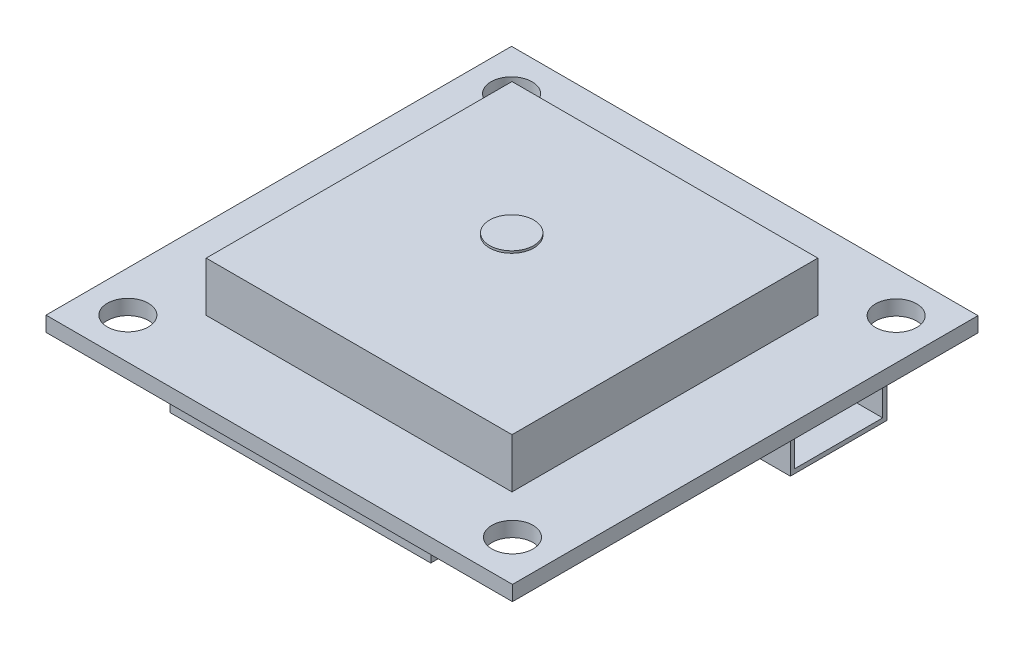
ISO-10303-21;
HEADER;
FILE_DESCRIPTION(('STEP AP214'),'2;1');
FILE_NAME('part.step','',(''),(''),'','','');
FILE_SCHEMA(('AUTOMOTIVE_DESIGN { 1 0 10303 214 1 1 1 1 }'));
ENDSEC;
DATA;
#1=APPLICATION_CONTEXT('core data for automotive mechanical design processes');
#2=APPLICATION_PROTOCOL_DEFINITION('international standard','automotive_design',2000,#1);
#3=PRODUCT_CONTEXT('',#1,'mechanical');
#4=PRODUCT('Part','Part','',(#3));
#5=PRODUCT_RELATED_PRODUCT_CATEGORY('part','',(#4));
#6=PRODUCT_DEFINITION_FORMATION('','',#4);
#7=PRODUCT_DEFINITION_CONTEXT('part definition',#1,'design');
#8=PRODUCT_DEFINITION('design','',#6,#7);
#9=PRODUCT_DEFINITION_SHAPE('','',#8);
#10=(LENGTH_UNIT() NAMED_UNIT(*) SI_UNIT(.MILLI.,.METRE.));
#11=(NAMED_UNIT(*) PLANE_ANGLE_UNIT() SI_UNIT($,.RADIAN.));
#12=(NAMED_UNIT(*) SI_UNIT($,.STERADIAN.) SOLID_ANGLE_UNIT());
#13=UNCERTAINTY_MEASURE_WITH_UNIT(LENGTH_MEASURE(1.E-05),#10,'distance_accuracy_value','');
#14=(GEOMETRIC_REPRESENTATION_CONTEXT(3) GLOBAL_UNCERTAINTY_ASSIGNED_CONTEXT((#13)) GLOBAL_UNIT_ASSIGNED_CONTEXT((#10,
#11,#12)) REPRESENTATION_CONTEXT('',''));
#15=CARTESIAN_POINT('',(0.,0.,0.));
#16=DIRECTION('',(0.,0.,1.));
#17=DIRECTION('',(1.,0.,0.));
#18=AXIS2_PLACEMENT_3D('',#15,#16,#17);
#19=CARTESIAN_POINT('',(0.,0.,0.));
#20=DIRECTION('',(0.,-1.,0.));
#21=DIRECTION('',(0.,0.,-1.));
#22=AXIS2_PLACEMENT_3D('',#19,#20,#21);
#23=PLANE('',#22);
#24=DIRECTION('',(1.,0.,0.));
#25=VECTOR('',#24,1.);
#26=CARTESIAN_POINT('',(33.528,0.,-31.3055));
#27=LINE('',#26,#25);
#28=CARTESIAN_POINT('',(33.528,0.,-31.3055));
#29=VERTEX_POINT('',#28);
#30=CARTESIAN_POINT('',(37.846,0.,-31.3055));
#31=VERTEX_POINT('',#30);
#32=EDGE_CURVE('E307',#29,#31,#27,.T.);
#33=ORIENTED_EDGE('',*,*,#32,.F.);
#34=DIRECTION('',(0.,0.,-1.));
#35=VECTOR('',#34,1.);
#36=CARTESIAN_POINT('',(33.528,0.,-23.3553));
#37=LINE('',#36,#35);
#38=CARTESIAN_POINT('',(33.528,0.,-23.3553));
#39=VERTEX_POINT('',#38);
#40=EDGE_CURVE('E287',#39,#29,#37,.T.);
#41=ORIENTED_EDGE('',*,*,#40,.F.);
#42=DIRECTION('',(-1.,0.,0.));
#43=VECTOR('',#42,1.);
#44=CARTESIAN_POINT('',(33.528,0.,-23.3553));
#45=LINE('',#44,#43);
#46=CARTESIAN_POINT('',(37.846,0.,-23.3553));
#47=VERTEX_POINT('',#46);
#48=EDGE_CURVE('E298',#47,#39,#45,.T.);
#49=ORIENTED_EDGE('',*,*,#48,.F.);
#50=DIRECTION('',(0.,0.,1.));
#51=VECTOR('',#50,1.);
#52=CARTESIAN_POINT('',(37.846,0.,-23.3553));
#53=LINE('',#52,#51);
#54=EDGE_CURVE('E309',#31,#47,#53,.T.);
#55=ORIENTED_EDGE('',*,*,#54,.F.);
#56=EDGE_LOOP('',(#33,#41,#49,#55));
#57=FACE_BOUND('',#56,.T.);
#58=DIRECTION('',(0.,0.,1.));
#59=VECTOR('',#58,1.);
#60=CARTESIAN_POINT('',(0.,0.,0.));
#61=LINE('',#60,#59);
#62=CARTESIAN_POINT('',(0.,0.,-38.2778));
#63=VERTEX_POINT('',#62);
#64=CARTESIAN_POINT('',(0.,0.,0.));
#65=VERTEX_POINT('',#64);
#66=EDGE_CURVE('E382',#63,#65,#61,.T.);
#67=ORIENTED_EDGE('',*,*,#66,.F.);
#68=DIRECTION('',(-1.,0.,0.));
#69=VECTOR('',#68,1.);
#70=CARTESIAN_POINT('',(0.,0.,-38.2778));
#71=LINE('',#70,#69);
#72=CARTESIAN_POINT('',(38.354,0.,-38.2778));
#73=VERTEX_POINT('',#72);
#74=EDGE_CURVE('E387',#73,#63,#71,.T.);
#75=ORIENTED_EDGE('',*,*,#74,.F.);
#76=DIRECTION('',(0.,0.,-1.));
#77=VECTOR('',#76,1.);
#78=CARTESIAN_POINT('',(38.354,0.,0.));
#79=LINE('',#78,#77);
#80=CARTESIAN_POINT('',(38.354,0.,0.));
#81=VERTEX_POINT('',#80);
#82=EDGE_CURVE('E398',#81,#73,#79,.T.);
#83=ORIENTED_EDGE('',*,*,#82,.F.);
#84=DIRECTION('',(1.,0.,0.));
#85=VECTOR('',#84,1.);
#86=CARTESIAN_POINT('',(0.,0.,0.));
#87=LINE('',#86,#85);
#88=EDGE_CURVE('E396',#65,#81,#87,.T.);
#89=ORIENTED_EDGE('',*,*,#88,.F.);
#90=EDGE_LOOP('',(#67,#75,#83,#89));
#91=FACE_BOUND('',#90,.T.);
#92=CARTESIAN_POINT('',(22.2758,0.,-32.6263));
#93=DIRECTION('',(0.,-1.,0.));
#94=DIRECTION('',(0.,0.,-1.));
#95=AXIS2_PLACEMENT_3D('',#92,#93,#94);
#96=CIRCLE('',#95,3.3782);
#97=CARTESIAN_POINT('',(22.2758,0.,-36.0045));
#98=VERTEX_POINT('',#97);
#99=EDGE_CURVE('E322',#98,#98,#96,.T.);
#100=ORIENTED_EDGE('',*,*,#99,.F.);
#101=EDGE_LOOP('',(#100));
#102=FACE_BOUND('',#101,.T.);
#103=CARTESIAN_POINT('',(34.9885,0.,-3.3655));
#104=DIRECTION('',(0.,-1.,0.));
#105=DIRECTION('',(0.,0.,-1.));
#106=AXIS2_PLACEMENT_3D('',#103,#104,#105);
#107=CIRCLE('',#106,1.6891);
#108=CARTESIAN_POINT('',(34.9885,0.,-5.0546));
#109=VERTEX_POINT('',#108);
#110=EDGE_CURVE('E253',#109,#109,#107,.F.);
#111=ORIENTED_EDGE('',*,*,#110,.T.);
#112=EDGE_LOOP('',(#111));
#113=FACE_BOUND('',#112,.T.);
#114=CARTESIAN_POINT('',(3.36550000000002,0.,-3.3655));
#115=DIRECTION('',(0.,-1.,0.));
#116=DIRECTION('',(0.,0.,-1.));
#117=AXIS2_PLACEMENT_3D('',#114,#115,#116);
#118=CIRCLE('',#117,1.6891);
#119=CARTESIAN_POINT('',(3.36550000000002,0.,-5.0546));
#120=VERTEX_POINT('',#119);
#121=EDGE_CURVE('E247',#120,#120,#118,.F.);
#122=ORIENTED_EDGE('',*,*,#121,.T.);
#123=EDGE_LOOP('',(#122));
#124=FACE_BOUND('',#123,.T.);
#125=CARTESIAN_POINT('',(3.36550000000002,0.,-34.9123));
#126=DIRECTION('',(0.,-1.,0.));
#127=DIRECTION('',(0.,0.,-1.));
#128=AXIS2_PLACEMENT_3D('',#125,#126,#127);
#129=CIRCLE('',#128,1.68909999999999);
#130=CARTESIAN_POINT('',(3.36550000000002,0.,-36.6014));
#131=VERTEX_POINT('',#130);
#132=EDGE_CURVE('E241',#131,#131,#129,.F.);
#133=ORIENTED_EDGE('',*,*,#132,.T.);
#134=EDGE_LOOP('',(#133));
#135=FACE_BOUND('',#134,.T.);
#136=CARTESIAN_POINT('',(34.9885,0.,-34.9123));
#137=DIRECTION('',(0.,-1.,0.));
#138=DIRECTION('',(0.,0.,-1.));
#139=AXIS2_PLACEMENT_3D('',#136,#137,#138);
#140=CIRCLE('',#139,1.6891);
#141=CARTESIAN_POINT('',(34.9885,0.,-36.6014));
#142=VERTEX_POINT('',#141);
#143=EDGE_CURVE('E237',#142,#142,#140,.F.);
#144=ORIENTED_EDGE('',*,*,#143,.T.);
#145=EDGE_LOOP('',(#144));
#146=FACE_BOUND('',#145,.T.);
#147=DIRECTION('',(1.,0.,0.));
#148=VECTOR('',#147,1.);
#149=CARTESIAN_POINT('',(7.8613,0.,-18.77695));
#150=LINE('',#149,#148);
#151=CARTESIAN_POINT('',(7.8613,0.,-18.77695));
#152=VERTEX_POINT('',#151);
#153=CARTESIAN_POINT('',(30.3403,0.,-18.77695));
#154=VERTEX_POINT('',#153);
#155=EDGE_CURVE('E496',#152,#154,#150,.T.);
#156=ORIENTED_EDGE('',*,*,#155,.F.);
#157=DIRECTION('',(0.,0.,-1.));
#158=VECTOR('',#157,1.);
#159=CARTESIAN_POINT('',(7.8613,0.,-1.64464999999999));
#160=LINE('',#159,#158);
#161=CARTESIAN_POINT('',(7.8613,0.,-1.64464999999999));
#162=VERTEX_POINT('',#161);
#163=EDGE_CURVE('E221',#162,#152,#160,.T.);
#164=ORIENTED_EDGE('',*,*,#163,.F.);
#165=DIRECTION('',(-1.,0.,0.));
#166=VECTOR('',#165,1.);
#167=CARTESIAN_POINT('',(7.8613,0.,-1.64464999999999));
#168=LINE('',#167,#166);
#169=CARTESIAN_POINT('',(30.3403,0.,-1.64464999999999));
#170=VERTEX_POINT('',#169);
#171=EDGE_CURVE('E217',#170,#162,#168,.T.);
#172=ORIENTED_EDGE('',*,*,#171,.F.);
#173=DIRECTION('',(0.,0.,1.));
#174=VECTOR('',#173,1.);
#175=CARTESIAN_POINT('',(30.3403,0.,-1.64464999999999));
#176=LINE('',#175,#174);
#177=EDGE_CURVE('E498',#154,#170,#176,.T.);
#178=ORIENTED_EDGE('',*,*,#177,.F.);
#179=EDGE_LOOP('',(#156,#164,#172,#178));
#180=FACE_BOUND('',#179,.T.);
#181=ADVANCED_FACE('F38',(#57,#91,#102,#113,#124,#135,#146,#180),#23,.T.);
#182=CARTESIAN_POINT('',(0.,5.3086,0.));
#183=DIRECTION('',(0.,-1.,0.));
#184=DIRECTION('',(0.,0.,-1.));
#185=AXIS2_PLACEMENT_3D('',#182,#183,#184);
#186=PLANE('',#185);
#187=DIRECTION('',(0.,0.,-1.));
#188=VECTOR('',#187,1.);
#189=CARTESIAN_POINT('',(31.75,5.3086,-31.7119));
#190=LINE('',#189,#188);
#191=CARTESIAN_POINT('',(31.75,5.3086,-6.5659));
#192=VERTEX_POINT('',#191);
#193=CARTESIAN_POINT('',(31.75,5.3086,-31.7119));
#194=VERTEX_POINT('',#193);
#195=EDGE_CURVE('E350',#192,#194,#190,.T.);
#196=ORIENTED_EDGE('',*,*,#195,.T.);
#197=DIRECTION('',(-1.,0.,0.));
#198=VECTOR('',#197,1.);
#199=CARTESIAN_POINT('',(31.75,5.3086,-31.7119));
#200=LINE('',#199,#198);
#201=CARTESIAN_POINT('',(6.604,5.3086,-31.7119));
#202=VERTEX_POINT('',#201);
#203=EDGE_CURVE('E353',#194,#202,#200,.T.);
#204=ORIENTED_EDGE('',*,*,#203,.T.);
#205=DIRECTION('',(0.,0.,1.));
#206=VECTOR('',#205,1.);
#207=CARTESIAN_POINT('',(6.604,5.3086,-31.7119));
#208=LINE('',#207,#206);
#209=CARTESIAN_POINT('',(6.604,5.3086,-6.56589999999999));
#210=VERTEX_POINT('',#209);
#211=EDGE_CURVE('E356',#202,#210,#208,.T.);
#212=ORIENTED_EDGE('',*,*,#211,.T.);
#213=DIRECTION('',(1.,0.,0.));
#214=VECTOR('',#213,1.);
#215=CARTESIAN_POINT('',(31.75,5.3086,-6.5659));
#216=LINE('',#215,#214);
#217=EDGE_CURVE('E358',#210,#192,#216,.T.);
#218=ORIENTED_EDGE('',*,*,#217,.T.);
#219=EDGE_LOOP('',(#196,#204,#212,#218));
#220=FACE_BOUND('',#219,.T.);
#221=CARTESIAN_POINT('',(17.5387,5.3086,-20.7518));
#222=DIRECTION('',(0.,-1.,0.));
#223=DIRECTION('',(0.,0.,-1.));
#224=AXIS2_PLACEMENT_3D('',#221,#222,#223);
#225=CIRCLE('',#224,1.8161);
#226=CARTESIAN_POINT('',(17.5387,5.3086,-22.5679));
#227=VERTEX_POINT('',#226);
#228=EDGE_CURVE('E46',#227,#227,#225,.F.);
#229=ORIENTED_EDGE('',*,*,#228,.F.);
#230=EDGE_LOOP('',(#229));
#231=FACE_BOUND('',#230,.T.);
#232=ADVANCED_FACE('F416',(#220,#231),#186,.F.);
#233=CARTESIAN_POINT('',(0.,1.2319,0.));
#234=DIRECTION('',(0.,-1.,0.));
#235=DIRECTION('',(0.,0.,-1.));
#236=AXIS2_PLACEMENT_3D('',#233,#234,#235);
#237=PLANE('',#236);
#238=CARTESIAN_POINT('',(34.9885,1.2319,-34.9123));
#239=DIRECTION('',(0.,1.,0.));
#240=DIRECTION('',(0.,0.,1.));
#241=AXIS2_PLACEMENT_3D('',#238,#239,#240);
#242=CIRCLE('',#241,1.6891);
#243=CARTESIAN_POINT('',(34.9885,1.2319,-33.2232));
#244=VERTEX_POINT('',#243);
#245=EDGE_CURVE('E238',#244,#244,#242,.T.);
#246=ORIENTED_EDGE('',*,*,#245,.F.);
#247=EDGE_LOOP('',(#246));
#248=FACE_BOUND('',#247,.T.);
#249=CARTESIAN_POINT('',(3.36550000000002,1.2319,-34.9123));
#250=DIRECTION('',(0.,1.,0.));
#251=DIRECTION('',(0.,0.,1.));
#252=AXIS2_PLACEMENT_3D('',#249,#250,#251);
#253=CIRCLE('',#252,1.68909999999999);
#254=CARTESIAN_POINT('',(3.36550000000002,1.2319,-33.2232));
#255=VERTEX_POINT('',#254);
#256=EDGE_CURVE('E244',#255,#255,#253,.T.);
#257=ORIENTED_EDGE('',*,*,#256,.F.);
#258=EDGE_LOOP('',(#257));
#259=FACE_BOUND('',#258,.T.);
#260=CARTESIAN_POINT('',(3.36550000000002,1.2319,-3.3655));
#261=DIRECTION('',(0.,1.,0.));
#262=DIRECTION('',(0.,0.,1.));
#263=AXIS2_PLACEMENT_3D('',#260,#261,#262);
#264=CIRCLE('',#263,1.6891);
#265=CARTESIAN_POINT('',(3.36550000000002,1.2319,-1.6764));
#266=VERTEX_POINT('',#265);
#267=EDGE_CURVE('E250',#266,#266,#264,.T.);
#268=ORIENTED_EDGE('',*,*,#267,.F.);
#269=EDGE_LOOP('',(#268));
#270=FACE_BOUND('',#269,.T.);
#271=CARTESIAN_POINT('',(34.9885,1.2319,-3.3655));
#272=DIRECTION('',(0.,1.,0.));
#273=DIRECTION('',(0.,0.,1.));
#274=AXIS2_PLACEMENT_3D('',#271,#272,#273);
#275=CIRCLE('',#274,1.6891);
#276=CARTESIAN_POINT('',(34.9885,1.2319,-1.6764));
#277=VERTEX_POINT('',#276);
#278=EDGE_CURVE('E256',#277,#277,#275,.T.);
#279=ORIENTED_EDGE('',*,*,#278,.F.);
#280=EDGE_LOOP('',(#279));
#281=FACE_BOUND('',#280,.T.);
#282=DIRECTION('',(0.,0.,1.));
#283=VECTOR('',#282,1.);
#284=CARTESIAN_POINT('',(0.,1.2319,0.));
#285=LINE('',#284,#283);
#286=CARTESIAN_POINT('',(0.,1.2319,-38.2778));
#287=VERTEX_POINT('',#286);
#288=CARTESIAN_POINT('',(0.,1.2319,0.));
#289=VERTEX_POINT('',#288);
#290=EDGE_CURVE('E383',#287,#289,#285,.T.);
#291=ORIENTED_EDGE('',*,*,#290,.T.);
#292=DIRECTION('',(1.,0.,0.));
#293=VECTOR('',#292,1.);
#294=CARTESIAN_POINT('',(0.,1.2319,0.));
#295=LINE('',#294,#293);
#296=CARTESIAN_POINT('',(38.354,1.2319,0.));
#297=VERTEX_POINT('',#296);
#298=EDGE_CURVE('E386',#289,#297,#295,.T.);
#299=ORIENTED_EDGE('',*,*,#298,.T.);
#300=DIRECTION('',(0.,0.,-1.));
#301=VECTOR('',#300,1.);
#302=CARTESIAN_POINT('',(38.354,1.2319,0.));
#303=LINE('',#302,#301);
#304=CARTESIAN_POINT('',(38.354,1.2319,-38.2778));
#305=VERTEX_POINT('',#304);
#306=EDGE_CURVE('E389',#297,#305,#303,.T.);
#307=ORIENTED_EDGE('',*,*,#306,.T.);
#308=DIRECTION('',(-1.,0.,0.));
#309=VECTOR('',#308,1.);
#310=CARTESIAN_POINT('',(0.,1.2319,-38.2778));
#311=LINE('',#310,#309);
#312=EDGE_CURVE('E391',#305,#287,#311,.T.);
#313=ORIENTED_EDGE('',*,*,#312,.T.);
#314=EDGE_LOOP('',(#291,#299,#307,#313));
#315=FACE_BOUND('',#314,.T.);
#316=DIRECTION('',(0.,0.,-1.));
#317=VECTOR('',#316,1.);
#318=CARTESIAN_POINT('',(31.75,1.2319,-31.7119));
#319=LINE('',#318,#317);
#320=CARTESIAN_POINT('',(31.75,1.2319,-6.5659));
#321=VERTEX_POINT('',#320);
#322=CARTESIAN_POINT('',(31.75,1.2319,-31.7119));
#323=VERTEX_POINT('',#322);
#324=EDGE_CURVE('E349',#321,#323,#319,.T.);
#325=ORIENTED_EDGE('',*,*,#324,.F.);
#326=DIRECTION('',(1.,0.,0.));
#327=VECTOR('',#326,1.);
#328=CARTESIAN_POINT('',(31.75,1.2319,-6.5659));
#329=LINE('',#328,#327);
#330=CARTESIAN_POINT('',(6.604,1.2319,-6.56589999999999));
#331=VERTEX_POINT('',#330);
#332=EDGE_CURVE('E354',#331,#321,#329,.T.);
#333=ORIENTED_EDGE('',*,*,#332,.F.);
#334=DIRECTION('',(0.,0.,1.));
#335=VECTOR('',#334,1.);
#336=CARTESIAN_POINT('',(6.604,1.2319,-31.7119));
#337=LINE('',#336,#335);
#338=CARTESIAN_POINT('',(6.604,1.2319,-31.7119));
#339=VERTEX_POINT('',#338);
#340=EDGE_CURVE('E366',#339,#331,#337,.T.);
#341=ORIENTED_EDGE('',*,*,#340,.F.);
#342=DIRECTION('',(-1.,0.,0.));
#343=VECTOR('',#342,1.);
#344=CARTESIAN_POINT('',(31.75,1.2319,-31.7119));
#345=LINE('',#344,#343);
#346=EDGE_CURVE('E363',#323,#339,#345,.T.);
#347=ORIENTED_EDGE('',*,*,#346,.F.);
#348=EDGE_LOOP('',(#325,#333,#341,#347));
#349=FACE_BOUND('',#348,.T.);
#350=ADVANCED_FACE('F418',(#248,#259,#270,#281,#315,#349),#237,.F.);
#351=CARTESIAN_POINT('',(0.,1.2319,0.));
#352=DIRECTION('',(1.,0.,0.));
#353=DIRECTION('',(0.,0.,-1.));
#354=AXIS2_PLACEMENT_3D('',#351,#352,#353);
#355=PLANE('',#354);
#356=ORIENTED_EDGE('',*,*,#66,.T.);
#357=DIRECTION('',(0.,-1.,0.));
#358=VECTOR('',#357,1.);
#359=CARTESIAN_POINT('',(0.,1.2319,0.));
#360=LINE('',#359,#358);
#361=EDGE_CURVE('E409',#289,#65,#360,.T.);
#362=ORIENTED_EDGE('',*,*,#361,.F.);
#363=ORIENTED_EDGE('',*,*,#290,.F.);
#364=DIRECTION('',(0.,-1.,0.));
#365=VECTOR('',#364,1.);
#366=CARTESIAN_POINT('',(0.,1.2319,-38.2778));
#367=LINE('',#366,#365);
#368=EDGE_CURVE('E393',#287,#63,#367,.T.);
#369=ORIENTED_EDGE('',*,*,#368,.T.);
#370=EDGE_LOOP('',(#356,#362,#363,#369));
#371=FACE_BOUND('',#370,.T.);
#372=ADVANCED_FACE('F40',(#371),#355,.F.);
#373=CARTESIAN_POINT('',(0.,1.2319,0.));
#374=DIRECTION('',(0.,0.,-1.));
#375=DIRECTION('',(-1.,0.,0.));
#376=AXIS2_PLACEMENT_3D('',#373,#374,#375);
#377=PLANE('',#376);
#378=ORIENTED_EDGE('',*,*,#88,.T.);
#379=DIRECTION('',(0.,-1.,0.));
#380=VECTOR('',#379,1.);
#381=CARTESIAN_POINT('',(38.354,1.2319,0.));
#382=LINE('',#381,#380);
#383=EDGE_CURVE('E406',#297,#81,#382,.T.);
#384=ORIENTED_EDGE('',*,*,#383,.F.);
#385=ORIENTED_EDGE('',*,*,#298,.F.);
#386=ORIENTED_EDGE('',*,*,#361,.T.);
#387=EDGE_LOOP('',(#378,#384,#385,#386));
#388=FACE_BOUND('',#387,.T.);
#389=ADVANCED_FACE('F456',(#388),#377,.F.);
#390=CARTESIAN_POINT('',(38.354,1.2319,0.));
#391=DIRECTION('',(-1.,0.,0.));
#392=DIRECTION('',(0.,0.,1.));
#393=AXIS2_PLACEMENT_3D('',#390,#391,#392);
#394=PLANE('',#393);
#395=ORIENTED_EDGE('',*,*,#82,.T.);
#396=DIRECTION('',(0.,-1.,0.));
#397=VECTOR('',#396,1.);
#398=CARTESIAN_POINT('',(38.354,1.2319,-38.2778));
#399=LINE('',#398,#397);
#400=EDGE_CURVE('E403',#305,#73,#399,.T.);
#401=ORIENTED_EDGE('',*,*,#400,.F.);
#402=ORIENTED_EDGE('',*,*,#306,.F.);
#403=ORIENTED_EDGE('',*,*,#383,.T.);
#404=EDGE_LOOP('',(#395,#401,#402,#403));
#405=FACE_BOUND('',#404,.T.);
#406=ADVANCED_FACE('F453',(#405),#394,.F.);
#407=CARTESIAN_POINT('',(0.,1.2319,-38.2778));
#408=DIRECTION('',(0.,0.,1.));
#409=DIRECTION('',(1.,0.,0.));
#410=AXIS2_PLACEMENT_3D('',#407,#408,#409);
#411=PLANE('',#410);
#412=ORIENTED_EDGE('',*,*,#74,.T.);
#413=ORIENTED_EDGE('',*,*,#368,.F.);
#414=ORIENTED_EDGE('',*,*,#312,.F.);
#415=ORIENTED_EDGE('',*,*,#400,.T.);
#416=EDGE_LOOP('',(#412,#413,#414,#415));
#417=FACE_BOUND('',#416,.T.);
#418=ADVANCED_FACE('F448',(#417),#411,.F.);
#419=CARTESIAN_POINT('',(31.75,5.3086,-31.7119));
#420=DIRECTION('',(-1.,0.,0.));
#421=DIRECTION('',(0.,0.,1.));
#422=AXIS2_PLACEMENT_3D('',#419,#420,#421);
#423=PLANE('',#422);
#424=ORIENTED_EDGE('',*,*,#324,.T.);
#425=DIRECTION('',(0.,-1.,0.));
#426=VECTOR('',#425,1.);
#427=CARTESIAN_POINT('',(31.75,5.3086,-31.7119));
#428=LINE('',#427,#426);
#429=EDGE_CURVE('E379',#194,#323,#428,.T.);
#430=ORIENTED_EDGE('',*,*,#429,.F.);
#431=ORIENTED_EDGE('',*,*,#195,.F.);
#432=DIRECTION('',(0.,-1.,0.));
#433=VECTOR('',#432,1.);
#434=CARTESIAN_POINT('',(31.75,5.3086,-6.5659));
#435=LINE('',#434,#433);
#436=EDGE_CURVE('E360',#192,#321,#435,.T.);
#437=ORIENTED_EDGE('',*,*,#436,.T.);
#438=EDGE_LOOP('',(#424,#430,#431,#437));
#439=FACE_BOUND('',#438,.T.);
#440=ADVANCED_FACE('F445',(#439),#423,.F.);
#441=CARTESIAN_POINT('',(31.75,5.3086,-31.7119));
#442=DIRECTION('',(0.,0.,1.));
#443=DIRECTION('',(1.,0.,0.));
#444=AXIS2_PLACEMENT_3D('',#441,#442,#443);
#445=PLANE('',#444);
#446=ORIENTED_EDGE('',*,*,#346,.T.);
#447=DIRECTION('',(0.,-1.,0.));
#448=VECTOR('',#447,1.);
#449=CARTESIAN_POINT('',(6.604,5.3086,-31.7119));
#450=LINE('',#449,#448);
#451=EDGE_CURVE('E376',#202,#339,#450,.T.);
#452=ORIENTED_EDGE('',*,*,#451,.F.);
#453=ORIENTED_EDGE('',*,*,#203,.F.);
#454=ORIENTED_EDGE('',*,*,#429,.T.);
#455=EDGE_LOOP('',(#446,#452,#453,#454));
#456=FACE_BOUND('',#455,.T.);
#457=ADVANCED_FACE('F441',(#456),#445,.F.);
#458=CARTESIAN_POINT('',(6.604,5.3086,-31.7119));
#459=DIRECTION('',(1.,0.,0.));
#460=DIRECTION('',(0.,0.,-1.));
#461=AXIS2_PLACEMENT_3D('',#458,#459,#460);
#462=PLANE('',#461);
#463=ORIENTED_EDGE('',*,*,#340,.T.);
#464=DIRECTION('',(0.,-1.,0.));
#465=VECTOR('',#464,1.);
#466=CARTESIAN_POINT('',(6.604,5.3086,-6.56589999999999));
#467=LINE('',#466,#465);
#468=EDGE_CURVE('E373',#210,#331,#467,.T.);
#469=ORIENTED_EDGE('',*,*,#468,.F.);
#470=ORIENTED_EDGE('',*,*,#211,.F.);
#471=ORIENTED_EDGE('',*,*,#451,.T.);
#472=EDGE_LOOP('',(#463,#469,#470,#471));
#473=FACE_BOUND('',#472,.T.);
#474=ADVANCED_FACE('F437',(#473),#462,.F.);
#475=CARTESIAN_POINT('',(31.75,5.3086,-6.5659));
#476=DIRECTION('',(0.,0.,-1.));
#477=DIRECTION('',(-1.,0.,0.));
#478=AXIS2_PLACEMENT_3D('',#475,#476,#477);
#479=PLANE('',#478);
#480=ORIENTED_EDGE('',*,*,#332,.T.);
#481=ORIENTED_EDGE('',*,*,#436,.F.);
#482=ORIENTED_EDGE('',*,*,#217,.F.);
#483=ORIENTED_EDGE('',*,*,#468,.T.);
#484=EDGE_LOOP('',(#480,#481,#482,#483));
#485=FACE_BOUND('',#484,.T.);
#486=ADVANCED_FACE('F433',(#485),#479,.F.);
#487=CARTESIAN_POINT('',(22.2758,-2.1082,-32.6263));
#488=DIRECTION('',(0.,1.,0.));
#489=DIRECTION('',(0.,0.,1.));
#490=AXIS2_PLACEMENT_3D('',#487,#488,#489);
#491=CYLINDRICAL_SURFACE('',#490,3.3782);
#492=CARTESIAN_POINT('',(22.2758,-2.1082,-32.6263));
#493=DIRECTION('',(0.,-1.,0.));
#494=DIRECTION('',(0.,0.,-1.));
#495=AXIS2_PLACEMENT_3D('',#492,#493,#494);
#496=CIRCLE('',#495,3.3782);
#497=CARTESIAN_POINT('',(22.2758,-2.1082,-36.0045));
#498=VERTEX_POINT('',#497);
#499=EDGE_CURVE('E323',#498,#498,#496,.T.);
#500=ORIENTED_EDGE('',*,*,#499,.F.);
#501=EDGE_LOOP('',(#500));
#502=FACE_BOUND('',#501,.T.);
#503=ORIENTED_EDGE('',*,*,#99,.T.);
#504=EDGE_LOOP('',(#503));
#505=FACE_BOUND('',#504,.T.);
#506=ADVANCED_FACE('F436',(#502,#505),#491,.T.);
#507=CARTESIAN_POINT('',(22.2758,-2.1082,-32.6263));
#508=DIRECTION('',(0.,-1.,0.));
#509=DIRECTION('',(0.,0.,-1.));
#510=AXIS2_PLACEMENT_3D('',#507,#508,#509);
#511=PLANE('',#510);
#512=ORIENTED_EDGE('',*,*,#499,.T.);
#513=EDGE_LOOP('',(#512));
#514=FACE_BOUND('',#513,.T.);
#515=ADVANCED_FACE('F589',(#514),#511,.T.);
#516=CARTESIAN_POINT('',(33.528,-2.9972,-23.3553));
#517=DIRECTION('',(1.,0.,0.));
#518=DIRECTION('',(0.,0.,-1.));
#519=AXIS2_PLACEMENT_3D('',#516,#517,#518);
#520=PLANE('',#519);
#521=ORIENTED_EDGE('',*,*,#40,.T.);
#522=DIRECTION('',(0.,1.,0.));
#523=VECTOR('',#522,1.);
#524=CARTESIAN_POINT('',(33.528,-2.9972,-31.3055));
#525=LINE('',#524,#523);
#526=CARTESIAN_POINT('',(33.528,-2.9972,-31.3055));
#527=VERTEX_POINT('',#526);
#528=EDGE_CURVE('E320',#527,#29,#525,.T.);
#529=ORIENTED_EDGE('',*,*,#528,.F.);
#530=DIRECTION('',(0.,0.,-1.));
#531=VECTOR('',#530,1.);
#532=CARTESIAN_POINT('',(33.528,-2.9972,-23.3553));
#533=LINE('',#532,#531);
#534=CARTESIAN_POINT('',(33.528,-2.9972,-23.3553));
#535=VERTEX_POINT('',#534);
#536=EDGE_CURVE('E294',#535,#527,#533,.T.);
#537=ORIENTED_EDGE('',*,*,#536,.F.);
#538=DIRECTION('',(0.,1.,0.));
#539=VECTOR('',#538,1.);
#540=CARTESIAN_POINT('',(33.528,-2.9972,-23.3553));
#541=LINE('',#540,#539);
#542=EDGE_CURVE('E304',#535,#39,#541,.T.);
#543=ORIENTED_EDGE('',*,*,#542,.T.);
#544=EDGE_LOOP('',(#521,#529,#537,#543));
#545=FACE_BOUND('',#544,.T.);
#546=ADVANCED_FACE('F585',(#545),#520,.F.);
#547=CARTESIAN_POINT('',(33.528,-2.9972,-31.3055));
#548=DIRECTION('',(0.,0.,1.));
#549=DIRECTION('',(1.,0.,0.));
#550=AXIS2_PLACEMENT_3D('',#547,#548,#549);
#551=PLANE('',#550);
#552=ORIENTED_EDGE('',*,*,#32,.T.);
#553=DIRECTION('',(0.,1.,0.));
#554=VECTOR('',#553,1.);
#555=CARTESIAN_POINT('',(37.846,-2.9972,-31.3055));
#556=LINE('',#555,#554);
#557=CARTESIAN_POINT('',(37.846,-2.9972,-31.3055));
#558=VERTEX_POINT('',#557);
#559=EDGE_CURVE('E317',#558,#31,#556,.T.);
#560=ORIENTED_EDGE('',*,*,#559,.F.);
#561=DIRECTION('',(1.,0.,0.));
#562=VECTOR('',#561,1.);
#563=CARTESIAN_POINT('',(33.528,-2.9972,-31.3055));
#564=LINE('',#563,#562);
#565=EDGE_CURVE('E297',#527,#558,#564,.T.);
#566=ORIENTED_EDGE('',*,*,#565,.F.);
#567=ORIENTED_EDGE('',*,*,#528,.T.);
#568=EDGE_LOOP('',(#552,#560,#566,#567));
#569=FACE_BOUND('',#568,.T.);
#570=ADVANCED_FACE('F581',(#569),#551,.F.);
#571=CARTESIAN_POINT('',(37.846,-2.9972,-23.3553));
#572=DIRECTION('',(-1.,0.,0.));
#573=DIRECTION('',(0.,0.,1.));
#574=AXIS2_PLACEMENT_3D('',#571,#572,#573);
#575=PLANE('',#574);
#576=DIRECTION('',(0.,0.,-1.));
#577=VECTOR('',#576,1.);
#578=CARTESIAN_POINT('',(37.846,-2.6416,-23.7109));
#579=LINE('',#578,#577);
#580=CARTESIAN_POINT('',(37.846,-2.6416,-23.7109));
#581=VERTEX_POINT('',#580);
#582=CARTESIAN_POINT('',(37.846,-2.6416,-30.9499));
#583=VERTEX_POINT('',#582);
#584=EDGE_CURVE('E277',#581,#583,#579,.T.);
#585=ORIENTED_EDGE('',*,*,#584,.F.);
#586=DIRECTION('',(0.,-1.,0.));
#587=VECTOR('',#586,1.);
#588=CARTESIAN_POINT('',(37.846,-0.3556,-23.7109));
#589=LINE('',#588,#587);
#590=CARTESIAN_POINT('',(37.846,-0.3556,-23.7109));
#591=VERTEX_POINT('',#590);
#592=EDGE_CURVE('E259',#591,#581,#589,.T.);
#593=ORIENTED_EDGE('',*,*,#592,.F.);
#594=DIRECTION('',(0.,0.,1.));
#595=VECTOR('',#594,1.);
#596=CARTESIAN_POINT('',(37.846,-0.3556,-23.7109));
#597=LINE('',#596,#595);
#598=CARTESIAN_POINT('',(37.846,-0.3556,-30.9499));
#599=VERTEX_POINT('',#598);
#600=EDGE_CURVE('E266',#599,#591,#597,.T.);
#601=ORIENTED_EDGE('',*,*,#600,.F.);
#602=DIRECTION('',(0.,1.,0.));
#603=VECTOR('',#602,1.);
#604=CARTESIAN_POINT('',(37.846,-0.3556,-30.9499));
#605=LINE('',#604,#603);
#606=EDGE_CURVE('E280',#583,#599,#605,.T.);
#607=ORIENTED_EDGE('',*,*,#606,.F.);
#608=EDGE_LOOP('',(#585,#593,#601,#607));
#609=FACE_BOUND('',#608,.T.);
#610=ORIENTED_EDGE('',*,*,#54,.T.);
#611=DIRECTION('',(0.,1.,0.));
#612=VECTOR('',#611,1.);
#613=CARTESIAN_POINT('',(37.846,-2.9972,-23.3553));
#614=LINE('',#613,#612);
#615=CARTESIAN_POINT('',(37.846,-2.9972,-23.3553));
#616=VERTEX_POINT('',#615);
#617=EDGE_CURVE('E315',#616,#47,#614,.T.);
#618=ORIENTED_EDGE('',*,*,#617,.F.);
#619=DIRECTION('',(0.,0.,1.));
#620=VECTOR('',#619,1.);
#621=CARTESIAN_POINT('',(37.846,-2.9972,-23.3553));
#622=LINE('',#621,#620);
#623=EDGE_CURVE('E300',#558,#616,#622,.T.);
#624=ORIENTED_EDGE('',*,*,#623,.F.);
#625=ORIENTED_EDGE('',*,*,#559,.T.);
#626=EDGE_LOOP('',(#610,#618,#624,#625));
#627=FACE_BOUND('',#626,.T.);
#628=ADVANCED_FACE('F577',(#609,#627),#575,.F.);
#629=CARTESIAN_POINT('',(33.528,-2.9972,-23.3553));
#630=DIRECTION('',(0.,0.,-1.));
#631=DIRECTION('',(-1.,0.,0.));
#632=AXIS2_PLACEMENT_3D('',#629,#630,#631);
#633=PLANE('',#632);
#634=ORIENTED_EDGE('',*,*,#48,.T.);
#635=ORIENTED_EDGE('',*,*,#542,.F.);
#636=DIRECTION('',(-1.,0.,0.));
#637=VECTOR('',#636,1.);
#638=CARTESIAN_POINT('',(33.528,-2.9972,-23.3553));
#639=LINE('',#638,#637);
#640=EDGE_CURVE('E302',#616,#535,#639,.T.);
#641=ORIENTED_EDGE('',*,*,#640,.F.);
#642=ORIENTED_EDGE('',*,*,#617,.T.);
#643=EDGE_LOOP('',(#634,#635,#641,#642));
#644=FACE_BOUND('',#643,.T.);
#645=ADVANCED_FACE('F573',(#644),#633,.F.);
#646=CARTESIAN_POINT('',(0.,-2.9972,0.));
#647=DIRECTION('',(0.,-1.,0.));
#648=DIRECTION('',(0.,0.,-1.));
#649=AXIS2_PLACEMENT_3D('',#646,#647,#648);
#650=PLANE('',#649);
#651=ORIENTED_EDGE('',*,*,#536,.T.);
#652=ORIENTED_EDGE('',*,*,#565,.T.);
#653=ORIENTED_EDGE('',*,*,#623,.T.);
#654=ORIENTED_EDGE('',*,*,#640,.T.);
#655=EDGE_LOOP('',(#651,#652,#653,#654));
#656=FACE_BOUND('',#655,.T.);
#657=ADVANCED_FACE('F569',(#656),#650,.T.);
#658=CARTESIAN_POINT('',(34.0868,-0.3556,-23.7109));
#659=DIRECTION('',(0.,0.,1.));
#660=DIRECTION('',(1.,0.,0.));
#661=AXIS2_PLACEMENT_3D('',#658,#659,#660);
#662=PLANE('',#661);
#663=ORIENTED_EDGE('',*,*,#592,.T.);
#664=DIRECTION('',(1.,0.,0.));
#665=VECTOR('',#664,1.);
#666=CARTESIAN_POINT('',(34.0868,-2.6416,-23.7109));
#667=LINE('',#666,#665);
#668=CARTESIAN_POINT('',(34.0868,-2.6416,-23.7109));
#669=VERTEX_POINT('',#668);
#670=EDGE_CURVE('E275',#669,#581,#667,.T.);
#671=ORIENTED_EDGE('',*,*,#670,.F.);
#672=DIRECTION('',(0.,-1.,0.));
#673=VECTOR('',#672,1.);
#674=CARTESIAN_POINT('',(34.0868,-0.3556,-23.7109));
#675=LINE('',#674,#673);
#676=CARTESIAN_POINT('',(34.0868,-0.3556,-23.7109));
#677=VERTEX_POINT('',#676);
#678=EDGE_CURVE('E262',#677,#669,#675,.T.);
#679=ORIENTED_EDGE('',*,*,#678,.F.);
#680=DIRECTION('',(1.,0.,0.));
#681=VECTOR('',#680,1.);
#682=CARTESIAN_POINT('',(34.0868,-0.3556,-23.7109));
#683=LINE('',#682,#681);
#684=EDGE_CURVE('E285',#677,#591,#683,.T.);
#685=ORIENTED_EDGE('',*,*,#684,.T.);
#686=EDGE_LOOP('',(#663,#671,#679,#685));
#687=FACE_BOUND('',#686,.T.);
#688=ADVANCED_FACE('F559',(#687),#662,.F.);
#689=CARTESIAN_POINT('',(34.0868,-0.3556,-23.7109));
#690=DIRECTION('',(0.,1.,0.));
#691=DIRECTION('',(0.,0.,1.));
#692=AXIS2_PLACEMENT_3D('',#689,#690,#691);
#693=PLANE('',#692);
#694=ORIENTED_EDGE('',*,*,#600,.T.);
#695=ORIENTED_EDGE('',*,*,#684,.F.);
#696=DIRECTION('',(0.,0.,1.));
#697=VECTOR('',#696,1.);
#698=CARTESIAN_POINT('',(34.0868,-0.3556,-23.7109));
#699=LINE('',#698,#697);
#700=CARTESIAN_POINT('',(34.0868,-0.3556,-30.9499));
#701=VERTEX_POINT('',#700);
#702=EDGE_CURVE('E272',#701,#677,#699,.T.);
#703=ORIENTED_EDGE('',*,*,#702,.F.);
#704=DIRECTION('',(1.,0.,0.));
#705=VECTOR('',#704,1.);
#706=CARTESIAN_POINT('',(34.0868,-0.3556,-30.9499));
#707=LINE('',#706,#705);
#708=EDGE_CURVE('E288',#701,#599,#707,.T.);
#709=ORIENTED_EDGE('',*,*,#708,.T.);
#710=EDGE_LOOP('',(#694,#695,#703,#709));
#711=FACE_BOUND('',#710,.T.);
#712=ADVANCED_FACE('F555',(#711),#693,.F.);
#713=CARTESIAN_POINT('',(34.0868,-0.3556,-30.9499));
#714=DIRECTION('',(0.,0.,-1.));
#715=DIRECTION('',(-1.,0.,0.));
#716=AXIS2_PLACEMENT_3D('',#713,#714,#715);
#717=PLANE('',#716);
#718=ORIENTED_EDGE('',*,*,#606,.T.);
#719=ORIENTED_EDGE('',*,*,#708,.F.);
#720=DIRECTION('',(0.,1.,0.));
#721=VECTOR('',#720,1.);
#722=CARTESIAN_POINT('',(34.0868,-0.3556,-30.9499));
#723=LINE('',#722,#721);
#724=CARTESIAN_POINT('',(34.0868,-2.6416,-30.9499));
#725=VERTEX_POINT('',#724);
#726=EDGE_CURVE('E269',#725,#701,#723,.T.);
#727=ORIENTED_EDGE('',*,*,#726,.F.);
#728=DIRECTION('',(1.,0.,0.));
#729=VECTOR('',#728,1.);
#730=CARTESIAN_POINT('',(34.0868,-2.6416,-30.9499));
#731=LINE('',#730,#729);
#732=EDGE_CURVE('E290',#725,#583,#731,.T.);
#733=ORIENTED_EDGE('',*,*,#732,.T.);
#734=EDGE_LOOP('',(#718,#719,#727,#733));
#735=FACE_BOUND('',#734,.T.);
#736=ADVANCED_FACE('F558',(#735),#717,.F.);
#737=CARTESIAN_POINT('',(34.0868,-2.6416,-23.7109));
#738=DIRECTION('',(0.,-1.,0.));
#739=DIRECTION('',(0.,0.,-1.));
#740=AXIS2_PLACEMENT_3D('',#737,#738,#739);
#741=PLANE('',#740);
#742=ORIENTED_EDGE('',*,*,#584,.T.);
#743=ORIENTED_EDGE('',*,*,#732,.F.);
#744=DIRECTION('',(0.,0.,-1.));
#745=VECTOR('',#744,1.);
#746=CARTESIAN_POINT('',(34.0868,-2.6416,-23.7109));
#747=LINE('',#746,#745);
#748=EDGE_CURVE('E265',#669,#725,#747,.T.);
#749=ORIENTED_EDGE('',*,*,#748,.F.);
#750=ORIENTED_EDGE('',*,*,#670,.T.);
#751=EDGE_LOOP('',(#742,#743,#749,#750));
#752=FACE_BOUND('',#751,.T.);
#753=ADVANCED_FACE('F553',(#752),#741,.F.);
#754=CARTESIAN_POINT('',(34.0868,0.,0.));
#755=DIRECTION('',(1.,0.,0.));
#756=DIRECTION('',(0.,0.,-1.));
#757=AXIS2_PLACEMENT_3D('',#754,#755,#756);
#758=PLANE('',#757);
#759=ORIENTED_EDGE('',*,*,#678,.T.);
#760=ORIENTED_EDGE('',*,*,#748,.T.);
#761=ORIENTED_EDGE('',*,*,#726,.T.);
#762=ORIENTED_EDGE('',*,*,#702,.T.);
#763=EDGE_LOOP('',(#759,#760,#761,#762));
#764=FACE_BOUND('',#763,.T.);
#765=ADVANCED_FACE('F549',(#764),#758,.T.);
#766=CARTESIAN_POINT('',(34.9885,-2.9982,-3.3655));
#767=DIRECTION('',(0.,1.,0.));
#768=DIRECTION('',(0.,0.,1.));
#769=AXIS2_PLACEMENT_3D('',#766,#767,#768);
#770=CYLINDRICAL_SURFACE('',#769,1.6891);
#771=ORIENTED_EDGE('',*,*,#110,.F.);
#772=EDGE_LOOP('',(#771));
#773=FACE_BOUND('',#772,.T.);
#774=ORIENTED_EDGE('',*,*,#278,.T.);
#775=EDGE_LOOP('',(#774));
#776=FACE_BOUND('',#775,.T.);
#777=ADVANCED_FACE('F545',(#773,#776),#770,.F.);
#778=CARTESIAN_POINT('',(3.36550000000002,-2.9982,-3.3655));
#779=DIRECTION('',(0.,1.,0.));
#780=DIRECTION('',(0.,0.,1.));
#781=AXIS2_PLACEMENT_3D('',#778,#779,#780);
#782=CYLINDRICAL_SURFACE('',#781,1.6891);
#783=ORIENTED_EDGE('',*,*,#121,.F.);
#784=EDGE_LOOP('',(#783));
#785=FACE_BOUND('',#784,.T.);
#786=ORIENTED_EDGE('',*,*,#267,.T.);
#787=EDGE_LOOP('',(#786));
#788=FACE_BOUND('',#787,.T.);
#789=ADVANCED_FACE('F541',(#785,#788),#782,.F.);
#790=CARTESIAN_POINT('',(3.36550000000002,-2.9982,-34.9123));
#791=DIRECTION('',(0.,1.,0.));
#792=DIRECTION('',(0.,0.,1.));
#793=AXIS2_PLACEMENT_3D('',#790,#791,#792);
#794=CYLINDRICAL_SURFACE('',#793,1.68909999999999);
#795=ORIENTED_EDGE('',*,*,#132,.F.);
#796=EDGE_LOOP('',(#795));
#797=FACE_BOUND('',#796,.T.);
#798=ORIENTED_EDGE('',*,*,#256,.T.);
#799=EDGE_LOOP('',(#798));
#800=FACE_BOUND('',#799,.T.);
#801=ADVANCED_FACE('F537',(#797,#800),#794,.F.);
#802=CARTESIAN_POINT('',(34.9885,-2.9982,-34.9123));
#803=DIRECTION('',(0.,1.,0.));
#804=DIRECTION('',(0.,0.,1.));
#805=AXIS2_PLACEMENT_3D('',#802,#803,#804);
#806=CYLINDRICAL_SURFACE('',#805,1.6891);
#807=ORIENTED_EDGE('',*,*,#143,.F.);
#808=EDGE_LOOP('',(#807));
#809=FACE_BOUND('',#808,.T.);
#810=ORIENTED_EDGE('',*,*,#245,.T.);
#811=EDGE_LOOP('',(#810));
#812=FACE_BOUND('',#811,.T.);
#813=ADVANCED_FACE('F533',(#809,#812),#806,.F.);
#814=CARTESIAN_POINT('',(17.5387,5.4864,-20.7518));
#815=DIRECTION('',(0.,-1.,0.));
#816=DIRECTION('',(0.,0.,-1.));
#817=AXIS2_PLACEMENT_3D('',#814,#815,#816);
#818=CYLINDRICAL_SURFACE('',#817,1.8161);
#819=CARTESIAN_POINT('',(17.5387,5.4864,-20.7518));
#820=DIRECTION('',(0.,1.,0.));
#821=DIRECTION('',(0.,0.,1.));
#822=AXIS2_PLACEMENT_3D('',#819,#820,#821);
#823=CIRCLE('',#822,1.8161);
#824=CARTESIAN_POINT('',(17.5387,5.4864,-18.9357));
#825=VERTEX_POINT('',#824);
#826=EDGE_CURVE('E234',#825,#825,#823,.T.);
#827=ORIENTED_EDGE('',*,*,#826,.F.);
#828=EDGE_LOOP('',(#827));
#829=FACE_BOUND('',#828,.T.);
#830=ORIENTED_EDGE('',*,*,#228,.T.);
#831=EDGE_LOOP('',(#830));
#832=FACE_BOUND('',#831,.T.);
#833=ADVANCED_FACE('F414',(#829,#832),#818,.T.);
#834=CARTESIAN_POINT('',(17.5387,5.4864,-20.7518));
#835=DIRECTION('',(0.,1.,0.));
#836=DIRECTION('',(0.,0.,1.));
#837=AXIS2_PLACEMENT_3D('',#834,#835,#836);
#838=PLANE('',#837);
#839=ORIENTED_EDGE('',*,*,#826,.T.);
#840=EDGE_LOOP('',(#839));
#841=FACE_BOUND('',#840,.T.);
#842=ADVANCED_FACE('F527',(#841),#838,.T.);
#843=CARTESIAN_POINT('',(0.,-0.762,0.));
#844=DIRECTION('',(0.,-1.,0.));
#845=DIRECTION('',(0.,0.,-1.));
#846=AXIS2_PLACEMENT_3D('',#843,#844,#845);
#847=PLANE('',#846);
#848=DIRECTION('',(0.,0.,-1.));
#849=VECTOR('',#848,1.);
#850=CARTESIAN_POINT('',(7.8613,-0.762,-1.64464999999999));
#851=LINE('',#850,#849);
#852=CARTESIAN_POINT('',(7.8613,-0.762,-1.64464999999999));
#853=VERTEX_POINT('',#852);
#854=CARTESIAN_POINT('',(7.8613,-0.762,-18.77695));
#855=VERTEX_POINT('',#854);
#856=EDGE_CURVE('E209',#853,#855,#851,.T.);
#857=ORIENTED_EDGE('',*,*,#856,.T.);
#858=DIRECTION('',(1.,0.,0.));
#859=VECTOR('',#858,1.);
#860=CARTESIAN_POINT('',(7.8613,-0.762,-18.77695));
#861=LINE('',#860,#859);
#862=CARTESIAN_POINT('',(30.3403,-0.762,-18.77695));
#863=VERTEX_POINT('',#862);
#864=EDGE_CURVE('E198',#855,#863,#861,.T.);
#865=ORIENTED_EDGE('',*,*,#864,.T.);
#866=DIRECTION('',(0.,0.,1.));
#867=VECTOR('',#866,1.);
#868=CARTESIAN_POINT('',(30.3403,-0.762,-1.64464999999999));
#869=LINE('',#868,#867);
#870=CARTESIAN_POINT('',(30.3403,-0.762,-1.64464999999999));
#871=VERTEX_POINT('',#870);
#872=EDGE_CURVE('E208',#863,#871,#869,.T.);
#873=ORIENTED_EDGE('',*,*,#872,.T.);
#874=DIRECTION('',(-1.,0.,0.));
#875=VECTOR('',#874,1.);
#876=CARTESIAN_POINT('',(7.8613,-0.762,-1.64464999999999));
#877=LINE('',#876,#875);
#878=EDGE_CURVE('E213',#871,#853,#877,.T.);
#879=ORIENTED_EDGE('',*,*,#878,.T.);
#880=EDGE_LOOP('',(#857,#865,#873,#879));
#881=FACE_BOUND('',#880,.T.);
#882=DIRECTION('',(0.,0.,-1.));
#883=VECTOR('',#882,1.);
#884=CARTESIAN_POINT('',(8.382,-0.762,-1.81609999999999));
#885=LINE('',#884,#883);
#886=CARTESIAN_POINT('',(8.382,-0.762,-1.81609999999999));
#887=VERTEX_POINT('',#886);
#888=CARTESIAN_POINT('',(8.382,-0.762,-18.6055));
#889=VERTEX_POINT('',#888);
#890=EDGE_CURVE('E61',#887,#889,#885,.T.);
#891=ORIENTED_EDGE('',*,*,#890,.F.);
#892=DIRECTION('',(-1.,0.,0.));
#893=VECTOR('',#892,1.);
#894=CARTESIAN_POINT('',(8.382,-0.762,-1.81609999999999));
#895=LINE('',#894,#893);
#896=CARTESIAN_POINT('',(29.8196,-0.762,-1.81609999999999));
#897=VERTEX_POINT('',#896);
#898=EDGE_CURVE('E11',#897,#887,#895,.T.);
#899=ORIENTED_EDGE('',*,*,#898,.F.);
#900=DIRECTION('',(0.,0.,1.));
#901=VECTOR('',#900,1.);
#902=CARTESIAN_POINT('',(29.8196,-0.762,-1.81609999999999));
#903=LINE('',#902,#901);
#904=CARTESIAN_POINT('',(29.8196,-0.762,-18.6055));
#905=VERTEX_POINT('',#904);
#906=EDGE_CURVE('E223',#905,#897,#903,.T.);
#907=ORIENTED_EDGE('',*,*,#906,.F.);
#908=DIRECTION('',(1.,0.,0.));
#909=VECTOR('',#908,1.);
#910=CARTESIAN_POINT('',(8.382,-0.762,-18.6055));
#911=LINE('',#910,#909);
#912=EDGE_CURVE('E226',#889,#905,#911,.T.);
#913=ORIENTED_EDGE('',*,*,#912,.F.);
#914=EDGE_LOOP('',(#891,#899,#907,#913));
#915=FACE_BOUND('',#914,.T.);
#916=ADVANCED_FACE('F212',(#881,#915),#847,.T.);
#917=CARTESIAN_POINT('',(7.8613,-0.762,-1.64464999999999));
#918=DIRECTION('',(1.,0.,0.));
#919=DIRECTION('',(0.,0.,-1.));
#920=AXIS2_PLACEMENT_3D('',#917,#918,#919);
#921=PLANE('',#920);
#922=ORIENTED_EDGE('',*,*,#163,.T.);
#923=DIRECTION('',(0.,1.,0.));
#924=VECTOR('',#923,1.);
#925=CARTESIAN_POINT('',(7.8613,-0.762,-18.77695));
#926=LINE('',#925,#924);
#927=EDGE_CURVE('E202',#855,#152,#926,.T.);
#928=ORIENTED_EDGE('',*,*,#927,.F.);
#929=ORIENTED_EDGE('',*,*,#856,.F.);
#930=DIRECTION('',(0.,1.,0.));
#931=VECTOR('',#930,1.);
#932=CARTESIAN_POINT('',(7.8613,-0.762,-1.64464999999999));
#933=LINE('',#932,#931);
#934=EDGE_CURVE('E505',#853,#162,#933,.T.);
#935=ORIENTED_EDGE('',*,*,#934,.T.);
#936=EDGE_LOOP('',(#922,#928,#929,#935));
#937=FACE_BOUND('',#936,.T.);
#938=ADVANCED_FACE('F219',(#937),#921,.F.);
#939=CARTESIAN_POINT('',(7.8613,-0.762,-18.77695));
#940=DIRECTION('',(0.,0.,1.));
#941=DIRECTION('',(1.,0.,0.));
#942=AXIS2_PLACEMENT_3D('',#939,#940,#941);
#943=PLANE('',#942);
#944=ORIENTED_EDGE('',*,*,#155,.T.);
#945=DIRECTION('',(0.,1.,0.));
#946=VECTOR('',#945,1.);
#947=CARTESIAN_POINT('',(30.3403,-0.762,-18.77695));
#948=LINE('',#947,#946);
#949=EDGE_CURVE('E205',#863,#154,#948,.T.);
#950=ORIENTED_EDGE('',*,*,#949,.F.);
#951=ORIENTED_EDGE('',*,*,#864,.F.);
#952=ORIENTED_EDGE('',*,*,#927,.T.);
#953=EDGE_LOOP('',(#944,#950,#951,#952));
#954=FACE_BOUND('',#953,.T.);
#955=ADVANCED_FACE('F200',(#954),#943,.F.);
#956=CARTESIAN_POINT('',(30.3403,-0.762,-1.64464999999999));
#957=DIRECTION('',(-1.,0.,0.));
#958=DIRECTION('',(0.,0.,1.));
#959=AXIS2_PLACEMENT_3D('',#956,#957,#958);
#960=PLANE('',#959);
#961=ORIENTED_EDGE('',*,*,#177,.T.);
#962=DIRECTION('',(0.,1.,0.));
#963=VECTOR('',#962,1.);
#964=CARTESIAN_POINT('',(30.3403,-0.762,-1.64464999999999));
#965=LINE('',#964,#963);
#966=EDGE_CURVE('E53',#871,#170,#965,.T.);
#967=ORIENTED_EDGE('',*,*,#966,.F.);
#968=ORIENTED_EDGE('',*,*,#872,.F.);
#969=ORIENTED_EDGE('',*,*,#949,.T.);
#970=EDGE_LOOP('',(#961,#967,#968,#969));
#971=FACE_BOUND('',#970,.T.);
#972=ADVANCED_FACE('F508',(#971),#960,.F.);
#973=CARTESIAN_POINT('',(7.8613,-0.762,-1.64464999999999));
#974=DIRECTION('',(0.,0.,-1.));
#975=DIRECTION('',(-1.,0.,0.));
#976=AXIS2_PLACEMENT_3D('',#973,#974,#975);
#977=PLANE('',#976);
#978=ORIENTED_EDGE('',*,*,#171,.T.);
#979=ORIENTED_EDGE('',*,*,#934,.F.);
#980=ORIENTED_EDGE('',*,*,#878,.F.);
#981=ORIENTED_EDGE('',*,*,#966,.T.);
#982=EDGE_LOOP('',(#978,#979,#980,#981));
#983=FACE_BOUND('',#982,.T.);
#984=ADVANCED_FACE('F509',(#983),#977,.F.);
#985=CARTESIAN_POINT('',(0.,-2.4257,0.));
#986=DIRECTION('',(0.,-1.,0.));
#987=DIRECTION('',(0.,0.,-1.));
#988=AXIS2_PLACEMENT_3D('',#985,#986,#987);
#989=PLANE('',#988);
#990=DIRECTION('',(0.,0.,-1.));
#991=VECTOR('',#990,1.);
#992=CARTESIAN_POINT('',(8.382,-2.4257,-1.81609999999999));
#993=LINE('',#992,#991);
#994=CARTESIAN_POINT('',(8.382,-2.4257,-1.81609999999999));
#995=VERTEX_POINT('',#994);
#996=CARTESIAN_POINT('',(8.382,-2.4257,-18.6055));
#997=VERTEX_POINT('',#996);
#998=EDGE_CURVE('E326',#995,#997,#993,.T.);
#999=ORIENTED_EDGE('',*,*,#998,.T.);
#1000=DIRECTION('',(1.,0.,0.));
#1001=VECTOR('',#1000,1.);
#1002=CARTESIAN_POINT('',(8.382,-2.4257,-18.6055));
#1003=LINE('',#1002,#1001);
#1004=CARTESIAN_POINT('',(29.8196,-2.4257,-18.6055));
#1005=VERTEX_POINT('',#1004);
#1006=EDGE_CURVE('E331',#997,#1005,#1003,.T.);
#1007=ORIENTED_EDGE('',*,*,#1006,.T.);
#1008=DIRECTION('',(0.,0.,1.));
#1009=VECTOR('',#1008,1.);
#1010=CARTESIAN_POINT('',(29.8196,-2.4257,-1.81609999999999));
#1011=LINE('',#1010,#1009);
#1012=CARTESIAN_POINT('',(29.8196,-2.4257,-1.81609999999999));
#1013=VERTEX_POINT('',#1012);
#1014=EDGE_CURVE('E333',#1005,#1013,#1011,.T.);
#1015=ORIENTED_EDGE('',*,*,#1014,.T.);
#1016=DIRECTION('',(-1.,0.,0.));
#1017=VECTOR('',#1016,1.);
#1018=CARTESIAN_POINT('',(8.382,-2.4257,-1.81609999999999));
#1019=LINE('',#1018,#1017);
#1020=EDGE_CURVE('E335',#1013,#995,#1019,.T.);
#1021=ORIENTED_EDGE('',*,*,#1020,.T.);
#1022=EDGE_LOOP('',(#999,#1007,#1015,#1021));
#1023=FACE_BOUND('',#1022,.T.);
#1024=ADVANCED_FACE('F511',(#1023),#989,.T.);
#1025=CARTESIAN_POINT('',(8.382,-2.4257,-1.81609999999999));
#1026=DIRECTION('',(0.,0.,-1.));
#1027=DIRECTION('',(-1.,0.,0.));
#1028=AXIS2_PLACEMENT_3D('',#1025,#1026,#1027);
#1029=PLANE('',#1028);
#1030=DIRECTION('',(0.,1.,0.));
#1031=VECTOR('',#1030,1.);
#1032=CARTESIAN_POINT('',(29.8196,-2.4257,-1.81609999999999));
#1033=LINE('',#1032,#1031);
#1034=EDGE_CURVE('E340',#1013,#897,#1033,.T.);
#1035=ORIENTED_EDGE('',*,*,#1034,.T.);
#1036=ORIENTED_EDGE('',*,*,#898,.T.);
#1037=DIRECTION('',(0.,1.,0.));
#1038=VECTOR('',#1037,1.);
#1039=CARTESIAN_POINT('',(8.382,-2.4257,-1.81609999999999));
#1040=LINE('',#1039,#1038);
#1041=EDGE_CURVE('E337',#995,#887,#1040,.T.);
#1042=ORIENTED_EDGE('',*,*,#1041,.F.);
#1043=ORIENTED_EDGE('',*,*,#1020,.F.);
#1044=EDGE_LOOP('',(#1035,#1036,#1042,#1043));
#1045=FACE_BOUND('',#1044,.T.);
#1046=ADVANCED_FACE('F517',(#1045),#1029,.F.);
#1047=CARTESIAN_POINT('',(29.8196,-2.4257,-1.81609999999999));
#1048=DIRECTION('',(-1.,0.,0.));
#1049=DIRECTION('',(0.,0.,1.));
#1050=AXIS2_PLACEMENT_3D('',#1047,#1048,#1049);
#1051=PLANE('',#1050);
#1052=DIRECTION('',(0.,1.,0.));
#1053=VECTOR('',#1052,1.);
#1054=CARTESIAN_POINT('',(29.8196,-2.4257,-18.6055));
#1055=LINE('',#1054,#1053);
#1056=EDGE_CURVE('E343',#1005,#905,#1055,.T.);
#1057=ORIENTED_EDGE('',*,*,#1056,.T.);
#1058=ORIENTED_EDGE('',*,*,#906,.T.);
#1059=ORIENTED_EDGE('',*,*,#1034,.F.);
#1060=ORIENTED_EDGE('',*,*,#1014,.F.);
#1061=EDGE_LOOP('',(#1057,#1058,#1059,#1060));
#1062=FACE_BOUND('',#1061,.T.);
#1063=ADVANCED_FACE('F599',(#1062),#1051,.F.);
#1064=CARTESIAN_POINT('',(8.382,-2.4257,-18.6055));
#1065=DIRECTION('',(0.,0.,1.));
#1066=DIRECTION('',(1.,0.,0.));
#1067=AXIS2_PLACEMENT_3D('',#1064,#1065,#1066);
#1068=PLANE('',#1067);
#1069=DIRECTION('',(0.,1.,0.));
#1070=VECTOR('',#1069,1.);
#1071=CARTESIAN_POINT('',(8.382,-2.4257,-18.6055));
#1072=LINE('',#1071,#1070);
#1073=EDGE_CURVE('E346',#997,#889,#1072,.T.);
#1074=ORIENTED_EDGE('',*,*,#1073,.T.);
#1075=ORIENTED_EDGE('',*,*,#912,.T.);
#1076=ORIENTED_EDGE('',*,*,#1056,.F.);
#1077=ORIENTED_EDGE('',*,*,#1006,.F.);
#1078=EDGE_LOOP('',(#1074,#1075,#1076,#1077));
#1079=FACE_BOUND('',#1078,.T.);
#1080=ADVANCED_FACE('F602',(#1079),#1068,.F.);
#1081=CARTESIAN_POINT('',(8.382,-2.4257,-1.81609999999999));
#1082=DIRECTION('',(1.,0.,0.));
#1083=DIRECTION('',(0.,0.,-1.));
#1084=AXIS2_PLACEMENT_3D('',#1081,#1082,#1083);
#1085=PLANE('',#1084);
#1086=ORIENTED_EDGE('',*,*,#1041,.T.);
#1087=ORIENTED_EDGE('',*,*,#890,.T.);
#1088=ORIENTED_EDGE('',*,*,#1073,.F.);
#1089=ORIENTED_EDGE('',*,*,#998,.F.);
#1090=EDGE_LOOP('',(#1086,#1087,#1088,#1089));
#1091=FACE_BOUND('',#1090,.T.);
#1092=ADVANCED_FACE('F431',(#1091),#1085,.F.);
#1093=CLOSED_SHELL('',(#181,#232,#350,#372,#389,#406,#418,#440,#457,#474,#486,#506,#515,#546,
#570,#628,#645,#657,#688,#712,#736,#753,#765,#777,#789,#801,#813,#833,#842,#916,#938,#955,#972,
#984,#1024,#1046,#1063,#1080,#1092));
#1094=MANIFOLD_SOLID_BREP('B2',#1093);
#1095=ADVANCED_BREP_SHAPE_REPRESENTATION('',(#18,#1094),#14);
#1096=SHAPE_DEFINITION_REPRESENTATION(#9,#1095);
ENDSEC;
END-ISO-10303-21;
